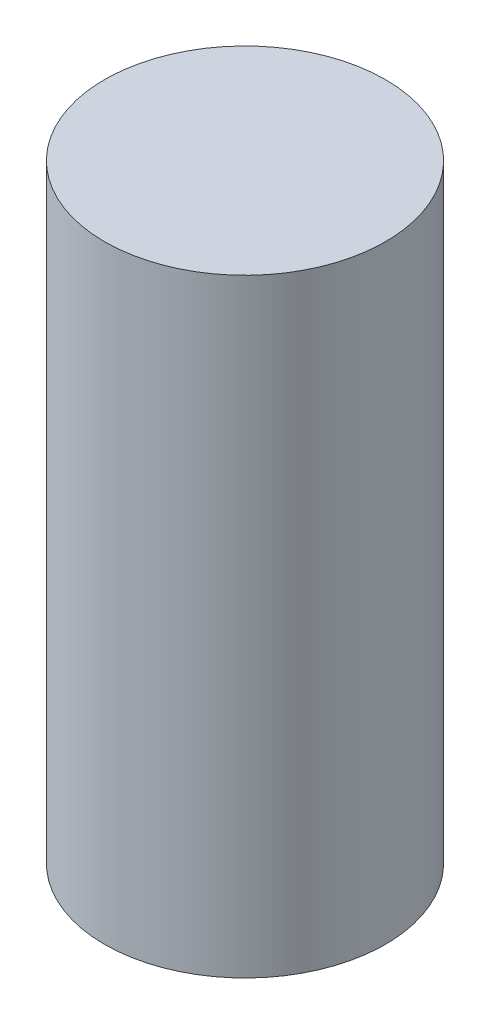
ISO-10303-21;
HEADER;
FILE_DESCRIPTION(('STEP AP214'),'2;1');
FILE_NAME('part.step','',(''),(''),'','','');
FILE_SCHEMA(('AUTOMOTIVE_DESIGN { 1 0 10303 214 1 1 1 1 }'));
ENDSEC;
DATA;
#1=APPLICATION_CONTEXT('core data for automotive mechanical design processes');
#2=APPLICATION_PROTOCOL_DEFINITION('international standard','automotive_design',2000,#1);
#3=PRODUCT_CONTEXT('',#1,'mechanical');
#4=PRODUCT('Part','Part','',(#3));
#5=PRODUCT_RELATED_PRODUCT_CATEGORY('part','',(#4));
#6=PRODUCT_DEFINITION_FORMATION('','',#4);
#7=PRODUCT_DEFINITION_CONTEXT('part definition',#1,'design');
#8=PRODUCT_DEFINITION('design','',#6,#7);
#9=PRODUCT_DEFINITION_SHAPE('','',#8);
#10=(LENGTH_UNIT() NAMED_UNIT(*) SI_UNIT(.MILLI.,.METRE.));
#11=(NAMED_UNIT(*) PLANE_ANGLE_UNIT() SI_UNIT($,.RADIAN.));
#12=(NAMED_UNIT(*) SI_UNIT($,.STERADIAN.) SOLID_ANGLE_UNIT());
#13=UNCERTAINTY_MEASURE_WITH_UNIT(LENGTH_MEASURE(1.E-05),#10,'distance_accuracy_value','');
#14=(GEOMETRIC_REPRESENTATION_CONTEXT(3) GLOBAL_UNCERTAINTY_ASSIGNED_CONTEXT((#13)) GLOBAL_UNIT_ASSIGNED_CONTEXT((#10,
#11,#12)) REPRESENTATION_CONTEXT('',''));
#15=CARTESIAN_POINT('',(0.,0.,0.));
#16=DIRECTION('',(0.,0.,1.));
#17=DIRECTION('',(1.,0.,0.));
#18=AXIS2_PLACEMENT_3D('',#15,#16,#17);
#19=CARTESIAN_POINT('',(0.,195.,0.));
#20=DIRECTION('',(0.,-1.,0.));
#21=DIRECTION('',(0.,0.,-1.));
#22=AXIS2_PLACEMENT_3D('',#19,#20,#21);
#23=CYLINDRICAL_SURFACE('',#22,45.);
#24=CARTESIAN_POINT('',(0.,195.,0.));
#25=DIRECTION('',(0.,1.,0.));
#26=DIRECTION('',(0.,0.,1.));
#27=AXIS2_PLACEMENT_3D('',#24,#25,#26);
#28=CIRCLE('',#27,45.);
#29=CARTESIAN_POINT('',(0.,195.,45.));
#30=VERTEX_POINT('',#29);
#31=EDGE_CURVE('E10',#30,#30,#28,.T.);
#32=ORIENTED_EDGE('',*,*,#31,.F.);
#33=EDGE_LOOP('',(#32));
#34=FACE_BOUND('',#33,.T.);
#35=CARTESIAN_POINT('',(0.,0.,0.));
#36=DIRECTION('',(0.,1.,0.));
#37=DIRECTION('',(0.,0.,1.));
#38=AXIS2_PLACEMENT_3D('',#35,#36,#37);
#39=CIRCLE('',#38,45.);
#40=CARTESIAN_POINT('',(0.,0.,45.));
#41=VERTEX_POINT('',#40);
#42=EDGE_CURVE('E40',#41,#41,#39,.T.);
#43=ORIENTED_EDGE('',*,*,#42,.T.);
#44=EDGE_LOOP('',(#43));
#45=FACE_BOUND('',#44,.T.);
#46=ADVANCED_FACE('F37',(#34,#45),#23,.T.);
#47=CARTESIAN_POINT('',(0.,195.,0.));
#48=DIRECTION('',(0.,1.,0.));
#49=DIRECTION('',(0.,0.,1.));
#50=AXIS2_PLACEMENT_3D('',#47,#48,#49);
#51=PLANE('',#50);
#52=ORIENTED_EDGE('',*,*,#31,.T.);
#53=EDGE_LOOP('',(#52));
#54=FACE_BOUND('',#53,.T.);
#55=ADVANCED_FACE('F54',(#54),#51,.T.);
#56=CARTESIAN_POINT('',(0.,0.,0.));
#57=DIRECTION('',(0.,1.,0.));
#58=DIRECTION('',(0.,0.,1.));
#59=AXIS2_PLACEMENT_3D('',#56,#57,#58);
#60=PLANE('',#59);
#61=ORIENTED_EDGE('',*,*,#42,.F.);
#62=EDGE_LOOP('',(#61));
#63=FACE_BOUND('',#62,.T.);
#64=ADVANCED_FACE('F52',(#63),#60,.F.);
#65=CLOSED_SHELL('',(#46,#55,#64));
#66=MANIFOLD_SOLID_BREP('B2',#65);
#67=ADVANCED_BREP_SHAPE_REPRESENTATION('',(#18,#66),#14);
#68=SHAPE_DEFINITION_REPRESENTATION(#9,#67);
ENDSEC;
END-ISO-10303-21;
